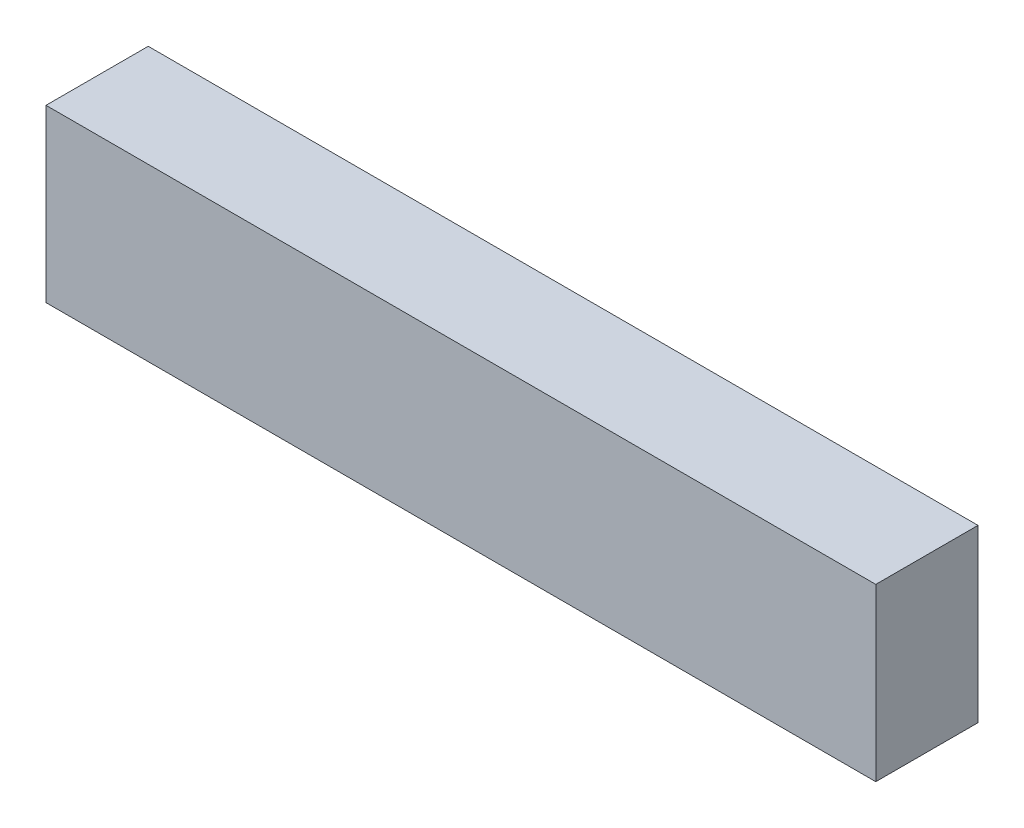
ISO-10303-21;
HEADER;
FILE_DESCRIPTION(('STEP AP214'),'2;1');
FILE_NAME('part.step','',(''),(''),'','','');
FILE_SCHEMA(('AUTOMOTIVE_DESIGN { 1 0 10303 214 1 1 1 1 }'));
ENDSEC;
DATA;
#1=APPLICATION_CONTEXT('core data for automotive mechanical design processes');
#2=APPLICATION_PROTOCOL_DEFINITION('international standard','automotive_design',2000,#1);
#3=PRODUCT_CONTEXT('',#1,'mechanical');
#4=PRODUCT('Part','Part','',(#3));
#5=PRODUCT_RELATED_PRODUCT_CATEGORY('part','',(#4));
#6=PRODUCT_DEFINITION_FORMATION('','',#4);
#7=PRODUCT_DEFINITION_CONTEXT('part definition',#1,'design');
#8=PRODUCT_DEFINITION('design','',#6,#7);
#9=PRODUCT_DEFINITION_SHAPE('','',#8);
#10=(LENGTH_UNIT() NAMED_UNIT(*) SI_UNIT(.MILLI.,.METRE.));
#11=(NAMED_UNIT(*) PLANE_ANGLE_UNIT() SI_UNIT($,.RADIAN.));
#12=(NAMED_UNIT(*) SI_UNIT($,.STERADIAN.) SOLID_ANGLE_UNIT());
#13=UNCERTAINTY_MEASURE_WITH_UNIT(LENGTH_MEASURE(1.E-05),#10,'distance_accuracy_value','');
#14=(GEOMETRIC_REPRESENTATION_CONTEXT(3) GLOBAL_UNCERTAINTY_ASSIGNED_CONTEXT((#13)) GLOBAL_UNIT_ASSIGNED_CONTEXT((#10,
#11,#12)) REPRESENTATION_CONTEXT('',''));
#15=CARTESIAN_POINT('',(0.,0.,0.));
#16=DIRECTION('',(0.,0.,1.));
#17=DIRECTION('',(1.,0.,0.));
#18=AXIS2_PLACEMENT_3D('',#15,#16,#17);
#19=CARTESIAN_POINT('',(20.1845000000004,-65.45,7.25));
#20=DIRECTION('',(1.,0.,0.));
#21=DIRECTION('',(0.,0.,-1.));
#22=AXIS2_PLACEMENT_3D('',#19,#20,#21);
#23=PLANE('',#22);
#24=DIRECTION('',(0.,-1.,0.));
#25=VECTOR('',#24,1.);
#26=CARTESIAN_POINT('',(20.1845000000004,-65.45,0.));
#27=LINE('',#26,#25);
#28=CARTESIAN_POINT('',(20.1845000000004,-65.45,0.));
#29=VERTEX_POINT('',#28);
#30=CARTESIAN_POINT('',(20.1845000000004,-77.5714301256037,0.));
#31=VERTEX_POINT('',#30);
#32=EDGE_CURVE('E128',#29,#31,#27,.T.);
#33=ORIENTED_EDGE('',*,*,#32,.T.);
#34=DIRECTION('',(0.,0.,-1.));
#35=VECTOR('',#34,1.);
#36=CARTESIAN_POINT('',(20.1845000000004,-77.5714301256037,7.25));
#37=LINE('',#36,#35);
#38=CARTESIAN_POINT('',(20.1845000000004,-77.5714301256037,7.25));
#39=VERTEX_POINT('',#38);
#40=EDGE_CURVE('E11',#39,#31,#37,.T.);
#41=ORIENTED_EDGE('',*,*,#40,.F.);
#42=DIRECTION('',(0.,-1.,0.));
#43=VECTOR('',#42,1.);
#44=CARTESIAN_POINT('',(20.1845000000004,-65.45,7.25));
#45=LINE('',#44,#43);
#46=CARTESIAN_POINT('',(20.1845000000004,-65.45,7.25));
#47=VERTEX_POINT('',#46);
#48=EDGE_CURVE('E148',#47,#39,#45,.T.);
#49=ORIENTED_EDGE('',*,*,#48,.F.);
#50=DIRECTION('',(0.,0.,-1.));
#51=VECTOR('',#50,1.);
#52=CARTESIAN_POINT('',(20.1845000000004,-65.45,7.25));
#53=LINE('',#52,#51);
#54=EDGE_CURVE('E153',#47,#29,#53,.T.);
#55=ORIENTED_EDGE('',*,*,#54,.T.);
#56=EDGE_LOOP('',(#33,#41,#49,#55));
#57=FACE_BOUND('',#56,.T.);
#58=ADVANCED_FACE('F32',(#57),#23,.F.);
#59=CARTESIAN_POINT('',(20.1845000000004,-77.5714301256037,7.25));
#60=DIRECTION('',(0.,1.,0.));
#61=DIRECTION('',(0.,0.,1.));
#62=AXIS2_PLACEMENT_3D('',#59,#60,#61);
#63=PLANE('',#62);
#64=DIRECTION('',(1.,0.,0.));
#65=VECTOR('',#64,1.);
#66=CARTESIAN_POINT('',(20.1845000000004,-77.5714301256037,0.));
#67=LINE('',#66,#65);
#68=CARTESIAN_POINT('',(79.0368014902547,-77.5714301256037,0.));
#69=VERTEX_POINT('',#68);
#70=EDGE_CURVE('E132',#31,#69,#67,.T.);
#71=ORIENTED_EDGE('',*,*,#70,.T.);
#72=DIRECTION('',(0.,0.,-1.));
#73=VECTOR('',#72,1.);
#74=CARTESIAN_POINT('',(79.0368014902547,-77.5714301256037,7.25));
#75=LINE('',#74,#73);
#76=CARTESIAN_POINT('',(79.0368014902547,-77.5714301256037,7.25));
#77=VERTEX_POINT('',#76);
#78=EDGE_CURVE('E39',#77,#69,#75,.T.);
#79=ORIENTED_EDGE('',*,*,#78,.F.);
#80=DIRECTION('',(1.,0.,0.));
#81=VECTOR('',#80,1.);
#82=CARTESIAN_POINT('',(20.1845000000004,-77.5714301256037,7.25));
#83=LINE('',#82,#81);
#84=EDGE_CURVE('E83',#39,#77,#83,.T.);
#85=ORIENTED_EDGE('',*,*,#84,.F.);
#86=ORIENTED_EDGE('',*,*,#40,.T.);
#87=EDGE_LOOP('',(#71,#79,#85,#86));
#88=FACE_BOUND('',#87,.T.);
#89=ADVANCED_FACE('F182',(#88),#63,.F.);
#90=CARTESIAN_POINT('',(79.0368014902547,-65.45,7.25));
#91=DIRECTION('',(-1.,0.,0.));
#92=DIRECTION('',(0.,0.,1.));
#93=AXIS2_PLACEMENT_3D('',#90,#91,#92);
#94=PLANE('',#93);
#95=DIRECTION('',(0.,1.,0.));
#96=VECTOR('',#95,1.);
#97=CARTESIAN_POINT('',(79.0368014902547,-65.45,0.));
#98=LINE('',#97,#96);
#99=CARTESIAN_POINT('',(79.0368014902547,-65.45,0.));
#100=VERTEX_POINT('',#99);
#101=EDGE_CURVE('E156',#69,#100,#98,.T.);
#102=ORIENTED_EDGE('',*,*,#101,.T.);
#103=DIRECTION('',(0.,0.,-1.));
#104=VECTOR('',#103,1.);
#105=CARTESIAN_POINT('',(79.0368014902547,-65.45,7.25));
#106=LINE('',#105,#104);
#107=CARTESIAN_POINT('',(79.0368014902547,-65.45,7.25));
#108=VERTEX_POINT('',#107);
#109=EDGE_CURVE('E160',#108,#100,#106,.T.);
#110=ORIENTED_EDGE('',*,*,#109,.F.);
#111=DIRECTION('',(0.,1.,0.));
#112=VECTOR('',#111,1.);
#113=CARTESIAN_POINT('',(79.0368014902547,-65.45,7.25));
#114=LINE('',#113,#112);
#115=EDGE_CURVE('E151',#77,#108,#114,.T.);
#116=ORIENTED_EDGE('',*,*,#115,.F.);
#117=ORIENTED_EDGE('',*,*,#78,.T.);
#118=EDGE_LOOP('',(#102,#110,#116,#117));
#119=FACE_BOUND('',#118,.T.);
#120=ADVANCED_FACE('F165',(#119),#94,.F.);
#121=CARTESIAN_POINT('',(20.1845000000004,-65.45,7.25));
#122=DIRECTION('',(0.,-1.,0.));
#123=DIRECTION('',(0.,0.,-1.));
#124=AXIS2_PLACEMENT_3D('',#121,#122,#123);
#125=PLANE('',#124);
#126=DIRECTION('',(-1.,0.,0.));
#127=VECTOR('',#126,1.);
#128=CARTESIAN_POINT('',(20.1845000000004,-65.45,0.));
#129=LINE('',#128,#127);
#130=EDGE_CURVE('E76',#100,#29,#129,.T.);
#131=ORIENTED_EDGE('',*,*,#130,.T.);
#132=ORIENTED_EDGE('',*,*,#54,.F.);
#133=DIRECTION('',(-1.,0.,0.));
#134=VECTOR('',#133,1.);
#135=CARTESIAN_POINT('',(20.1845000000004,-65.45,7.25));
#136=LINE('',#135,#134);
#137=EDGE_CURVE('E55',#108,#47,#136,.T.);
#138=ORIENTED_EDGE('',*,*,#137,.F.);
#139=ORIENTED_EDGE('',*,*,#109,.T.);
#140=EDGE_LOOP('',(#131,#132,#138,#139));
#141=FACE_BOUND('',#140,.T.);
#142=ADVANCED_FACE('F173',(#141),#125,.F.);
#143=CARTESIAN_POINT('',(0.,0.,7.25));
#144=DIRECTION('',(0.,0.,1.));
#145=DIRECTION('',(1.,0.,0.));
#146=AXIS2_PLACEMENT_3D('',#143,#144,#145);
#147=PLANE('',#146);
#148=ORIENTED_EDGE('',*,*,#48,.T.);
#149=ORIENTED_EDGE('',*,*,#84,.T.);
#150=ORIENTED_EDGE('',*,*,#115,.T.);
#151=ORIENTED_EDGE('',*,*,#137,.T.);
#152=EDGE_LOOP('',(#148,#149,#150,#151));
#153=FACE_BOUND('',#152,.T.);
#154=ADVANCED_FACE('F175',(#153),#147,.T.);
#155=CARTESIAN_POINT('',(0.,0.,0.));
#156=DIRECTION('',(0.,0.,1.));
#157=DIRECTION('',(1.,0.,0.));
#158=AXIS2_PLACEMENT_3D('',#155,#156,#157);
#159=PLANE('',#158);
#160=DIRECTION('',(-1.,0.,0.));
#161=VECTOR('',#160,1.);
#162=CARTESIAN_POINT('',(20.1845000000004,-65.95,0.));
#163=LINE('',#162,#161);
#164=CARTESIAN_POINT('',(78.5368014902547,-65.95,0.));
#165=VERTEX_POINT('',#164);
#166=CARTESIAN_POINT('',(20.6845000000004,-65.95,0.));
#167=VERTEX_POINT('',#166);
#168=EDGE_CURVE('E123',#165,#167,#163,.T.);
#169=ORIENTED_EDGE('',*,*,#168,.T.);
#170=DIRECTION('',(0.,-1.,0.));
#171=VECTOR('',#170,1.);
#172=CARTESIAN_POINT('',(20.6845000000004,-65.45,0.));
#173=LINE('',#172,#171);
#174=CARTESIAN_POINT('',(20.6845000000004,-77.0714301256037,0.));
#175=VERTEX_POINT('',#174);
#176=EDGE_CURVE('E142',#167,#175,#173,.T.);
#177=ORIENTED_EDGE('',*,*,#176,.T.);
#178=DIRECTION('',(1.,0.,0.));
#179=VECTOR('',#178,1.);
#180=CARTESIAN_POINT('',(20.1845000000004,-77.0714301256037,0.));
#181=LINE('',#180,#179);
#182=CARTESIAN_POINT('',(78.5368014902547,-77.0714301256037,0.));
#183=VERTEX_POINT('',#182);
#184=EDGE_CURVE('E127',#175,#183,#181,.T.);
#185=ORIENTED_EDGE('',*,*,#184,.T.);
#186=DIRECTION('',(0.,1.,0.));
#187=VECTOR('',#186,1.);
#188=CARTESIAN_POINT('',(78.5368014902547,-65.45,0.));
#189=LINE('',#188,#187);
#190=EDGE_CURVE('E46',#183,#165,#189,.T.);
#191=ORIENTED_EDGE('',*,*,#190,.T.);
#192=EDGE_LOOP('',(#169,#177,#185,#191));
#193=FACE_BOUND('',#192,.T.);
#194=ORIENTED_EDGE('',*,*,#32,.F.);
#195=ORIENTED_EDGE('',*,*,#130,.F.);
#196=ORIENTED_EDGE('',*,*,#101,.F.);
#197=ORIENTED_EDGE('',*,*,#70,.F.);
#198=EDGE_LOOP('',(#194,#195,#196,#197));
#199=FACE_BOUND('',#198,.T.);
#200=ADVANCED_FACE('F169',(#193,#199),#159,.F.);
#201=CARTESIAN_POINT('',(20.6845000000004,-65.45,7.25));
#202=DIRECTION('',(1.,0.,0.));
#203=DIRECTION('',(0.,0.,-1.));
#204=AXIS2_PLACEMENT_3D('',#201,#202,#203);
#205=PLANE('',#204);
#206=ORIENTED_EDGE('',*,*,#176,.F.);
#207=DIRECTION('',(0.,0.,-1.));
#208=VECTOR('',#207,1.);
#209=CARTESIAN_POINT('',(20.6845000000004,-65.95,7.25));
#210=LINE('',#209,#208);
#211=CARTESIAN_POINT('',(20.6845000000004,-65.95,7.05));
#212=VERTEX_POINT('',#211);
#213=EDGE_CURVE('E122',#212,#167,#210,.T.);
#214=ORIENTED_EDGE('',*,*,#213,.F.);
#215=DIRECTION('',(0.,-1.,0.));
#216=VECTOR('',#215,1.);
#217=CARTESIAN_POINT('',(20.6845000000004,-65.45,7.05));
#218=LINE('',#217,#216);
#219=CARTESIAN_POINT('',(20.6845000000004,-77.0714301256037,7.05));
#220=VERTEX_POINT('',#219);
#221=EDGE_CURVE('E110',#212,#220,#218,.T.);
#222=ORIENTED_EDGE('',*,*,#221,.T.);
#223=DIRECTION('',(0.,0.,-1.));
#224=VECTOR('',#223,1.);
#225=CARTESIAN_POINT('',(20.6845000000004,-77.0714301256037,7.25));
#226=LINE('',#225,#224);
#227=EDGE_CURVE('E120',#220,#175,#226,.T.);
#228=ORIENTED_EDGE('',*,*,#227,.T.);
#229=EDGE_LOOP('',(#206,#214,#222,#228));
#230=FACE_BOUND('',#229,.T.);
#231=ADVANCED_FACE('F119',(#230),#205,.T.);
#232=CARTESIAN_POINT('',(20.1845000000004,-77.0714301256037,7.25));
#233=DIRECTION('',(0.,1.,0.));
#234=DIRECTION('',(0.,0.,1.));
#235=AXIS2_PLACEMENT_3D('',#232,#233,#234);
#236=PLANE('',#235);
#237=ORIENTED_EDGE('',*,*,#184,.F.);
#238=ORIENTED_EDGE('',*,*,#227,.F.);
#239=DIRECTION('',(1.,0.,0.));
#240=VECTOR('',#239,1.);
#241=CARTESIAN_POINT('',(20.1845000000004,-77.0714301256037,7.05));
#242=LINE('',#241,#240);
#243=CARTESIAN_POINT('',(78.5368014902547,-77.0714301256037,7.05));
#244=VERTEX_POINT('',#243);
#245=EDGE_CURVE('E106',#220,#244,#242,.T.);
#246=ORIENTED_EDGE('',*,*,#245,.T.);
#247=DIRECTION('',(0.,0.,-1.));
#248=VECTOR('',#247,1.);
#249=CARTESIAN_POINT('',(78.5368014902547,-77.0714301256037,7.25));
#250=LINE('',#249,#248);
#251=EDGE_CURVE('E129',#244,#183,#250,.T.);
#252=ORIENTED_EDGE('',*,*,#251,.T.);
#253=EDGE_LOOP('',(#237,#238,#246,#252));
#254=FACE_BOUND('',#253,.T.);
#255=ADVANCED_FACE('F125',(#254),#236,.T.);
#256=CARTESIAN_POINT('',(78.5368014902547,-65.45,7.25));
#257=DIRECTION('',(-1.,0.,0.));
#258=DIRECTION('',(0.,0.,1.));
#259=AXIS2_PLACEMENT_3D('',#256,#257,#258);
#260=PLANE('',#259);
#261=ORIENTED_EDGE('',*,*,#190,.F.);
#262=ORIENTED_EDGE('',*,*,#251,.F.);
#263=DIRECTION('',(0.,1.,0.));
#264=VECTOR('',#263,1.);
#265=CARTESIAN_POINT('',(78.5368014902547,-65.45,7.05));
#266=LINE('',#265,#264);
#267=CARTESIAN_POINT('',(78.5368014902547,-65.95,7.05));
#268=VERTEX_POINT('',#267);
#269=EDGE_CURVE('E111',#244,#268,#266,.T.);
#270=ORIENTED_EDGE('',*,*,#269,.T.);
#271=DIRECTION('',(0.,0.,-1.));
#272=VECTOR('',#271,1.);
#273=CARTESIAN_POINT('',(78.5368014902547,-65.95,7.25));
#274=LINE('',#273,#272);
#275=EDGE_CURVE('E134',#268,#165,#274,.T.);
#276=ORIENTED_EDGE('',*,*,#275,.T.);
#277=EDGE_LOOP('',(#261,#262,#270,#276));
#278=FACE_BOUND('',#277,.T.);
#279=ADVANCED_FACE('F230',(#278),#260,.T.);
#280=CARTESIAN_POINT('',(20.1845000000004,-65.95,7.25));
#281=DIRECTION('',(0.,-1.,0.));
#282=DIRECTION('',(0.,0.,-1.));
#283=AXIS2_PLACEMENT_3D('',#280,#281,#282);
#284=PLANE('',#283);
#285=ORIENTED_EDGE('',*,*,#168,.F.);
#286=ORIENTED_EDGE('',*,*,#275,.F.);
#287=DIRECTION('',(-1.,0.,0.));
#288=VECTOR('',#287,1.);
#289=CARTESIAN_POINT('',(20.1845000000004,-65.95,7.05));
#290=LINE('',#289,#288);
#291=EDGE_CURVE('E137',#268,#212,#290,.T.);
#292=ORIENTED_EDGE('',*,*,#291,.T.);
#293=ORIENTED_EDGE('',*,*,#213,.T.);
#294=EDGE_LOOP('',(#285,#286,#292,#293));
#295=FACE_BOUND('',#294,.T.);
#296=ADVANCED_FACE('F239',(#295),#284,.T.);
#297=CARTESIAN_POINT('',(0.,0.,7.05));
#298=DIRECTION('',(0.,0.,1.));
#299=DIRECTION('',(1.,0.,0.));
#300=AXIS2_PLACEMENT_3D('',#297,#298,#299);
#301=PLANE('',#300);
#302=ORIENTED_EDGE('',*,*,#221,.F.);
#303=ORIENTED_EDGE('',*,*,#291,.F.);
#304=ORIENTED_EDGE('',*,*,#269,.F.);
#305=ORIENTED_EDGE('',*,*,#245,.F.);
#306=EDGE_LOOP('',(#302,#303,#304,#305));
#307=FACE_BOUND('',#306,.T.);
#308=ADVANCED_FACE('F108',(#307),#301,.F.);
#309=CLOSED_SHELL('',(#58,#89,#120,#142,#154,#200,#231,#255,#279,#296,#308));
#310=MANIFOLD_SOLID_BREP('B2',#309);
#311=ADVANCED_BREP_SHAPE_REPRESENTATION('',(#18,#310),#14);
#312=SHAPE_DEFINITION_REPRESENTATION(#9,#311);
ENDSEC;
END-ISO-10303-21;
